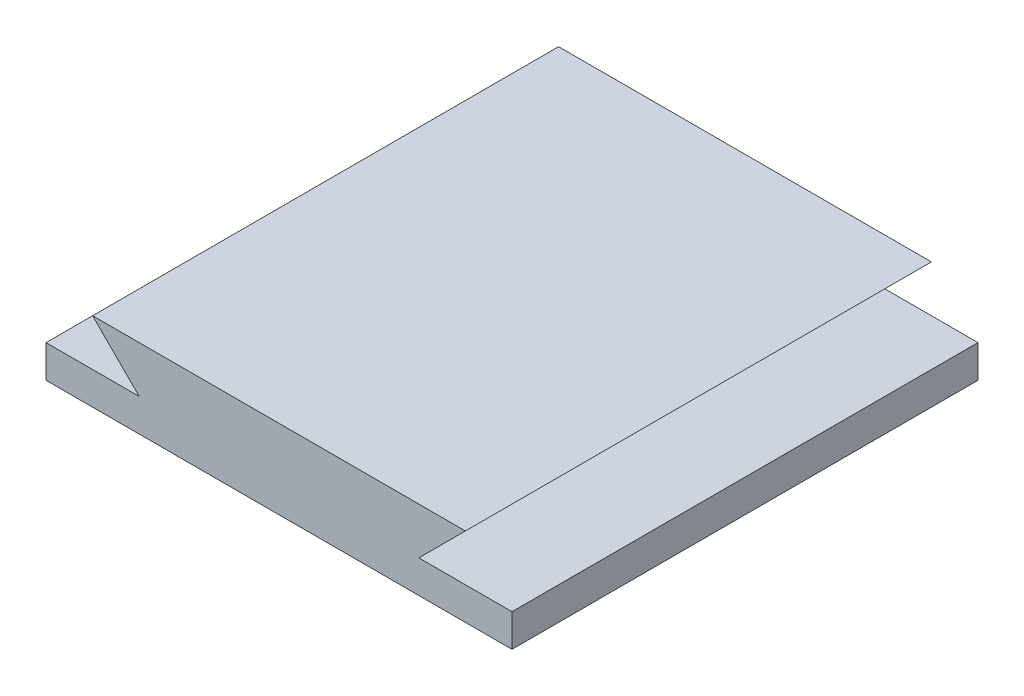
ISO-10303-21;
HEADER;
FILE_DESCRIPTION(('STEP AP214'),'2;1');
FILE_NAME('part.step','',(''),(''),'','','');
FILE_SCHEMA(('AUTOMOTIVE_DESIGN { 1 0 10303 214 1 1 1 1 }'));
ENDSEC;
DATA;
#1=APPLICATION_CONTEXT('core data for automotive mechanical design processes');
#2=APPLICATION_PROTOCOL_DEFINITION('international standard','automotive_design',2000,#1);
#3=PRODUCT_CONTEXT('',#1,'mechanical');
#4=PRODUCT('Part','Part','',(#3));
#5=PRODUCT_RELATED_PRODUCT_CATEGORY('part','',(#4));
#6=PRODUCT_DEFINITION_FORMATION('','',#4);
#7=PRODUCT_DEFINITION_CONTEXT('part definition',#1,'design');
#8=PRODUCT_DEFINITION('design','',#6,#7);
#9=PRODUCT_DEFINITION_SHAPE('','',#8);
#10=(LENGTH_UNIT() NAMED_UNIT(*) SI_UNIT(.MILLI.,.METRE.));
#11=(NAMED_UNIT(*) PLANE_ANGLE_UNIT() SI_UNIT($,.RADIAN.));
#12=(NAMED_UNIT(*) SI_UNIT($,.STERADIAN.) SOLID_ANGLE_UNIT());
#13=UNCERTAINTY_MEASURE_WITH_UNIT(LENGTH_MEASURE(1.E-05),#10,'distance_accuracy_value','');
#14=(GEOMETRIC_REPRESENTATION_CONTEXT(3) GLOBAL_UNCERTAINTY_ASSIGNED_CONTEXT((#13)) GLOBAL_UNIT_ASSIGNED_CONTEXT((#10,
#11,#12)) REPRESENTATION_CONTEXT('',''));
#15=CARTESIAN_POINT('',(0.,0.,0.));
#16=DIRECTION('',(0.,0.,1.));
#17=DIRECTION('',(1.,0.,0.));
#18=AXIS2_PLACEMENT_3D('',#15,#16,#17);
#19=CARTESIAN_POINT('',(13.2500000000002,-13.25,100.));
#20=DIRECTION('',(0.707106781186551,-0.707106781186544,0.));
#21=DIRECTION('',(0.707106781186544,0.707106781186551,0.));
#22=AXIS2_PLACEMENT_3D('',#19,#20,#21);
#23=PLANE('',#22);
#24=DIRECTION('',(-0.707106781186544,-0.707106781186551,0.));
#25=VECTOR('',#24,1.);
#26=CARTESIAN_POINT('',(13.2500000000002,-13.25,0.));
#27=LINE('',#26,#25);
#28=CARTESIAN_POINT('',(39.9999999999999,13.5,0.));
#29=VERTEX_POINT('',#28);
#30=CARTESIAN_POINT('',(30.,3.5,0.));
#31=VERTEX_POINT('',#30);
#32=EDGE_CURVE('E125',#29,#31,#27,.T.);
#33=ORIENTED_EDGE('',*,*,#32,.F.);
#34=DIRECTION('',(0.,0.,-1.));
#35=VECTOR('',#34,1.);
#36=CARTESIAN_POINT('',(39.9999999999999,13.5,100.));
#37=LINE('',#36,#35);
#38=CARTESIAN_POINT('',(39.9999999999999,13.5,100.));
#39=VERTEX_POINT('',#38);
#40=EDGE_CURVE('E11',#39,#29,#37,.T.);
#41=ORIENTED_EDGE('',*,*,#40,.F.);
#42=DIRECTION('',(-0.707106781186544,-0.707106781186551,0.));
#43=VECTOR('',#42,1.);
#44=CARTESIAN_POINT('',(13.2500000000002,-13.25,100.));
#45=LINE('',#44,#43);
#46=CARTESIAN_POINT('',(30.,3.5,100.));
#47=VERTEX_POINT('',#46);
#48=EDGE_CURVE('E170',#39,#47,#45,.T.);
#49=ORIENTED_EDGE('',*,*,#48,.T.);
#50=DIRECTION('',(0.,0.,-1.));
#51=VECTOR('',#50,1.);
#52=CARTESIAN_POINT('',(30.,3.5,100.));
#53=LINE('',#52,#51);
#54=EDGE_CURVE('E83',#47,#31,#53,.T.);
#55=ORIENTED_EDGE('',*,*,#54,.T.);
#56=EDGE_LOOP('',(#33,#41,#49,#55));
#57=FACE_BOUND('',#56,.T.);
#58=ADVANCED_FACE('F33',(#57),#23,.T.);
#59=CARTESIAN_POINT('',(0.,13.5,100.));
#60=DIRECTION('',(0.,1.,0.));
#61=DIRECTION('',(0.,0.,1.));
#62=AXIS2_PLACEMENT_3D('',#59,#60,#61);
#63=PLANE('',#62);
#64=DIRECTION('',(1.,0.,0.));
#65=VECTOR('',#64,1.);
#66=CARTESIAN_POINT('',(0.,13.5,0.));
#67=LINE('',#66,#65);
#68=CARTESIAN_POINT('',(-40.0000000000001,13.5,0.));
#69=VERTEX_POINT('',#68);
#70=EDGE_CURVE('E128',#69,#29,#67,.T.);
#71=ORIENTED_EDGE('',*,*,#70,.F.);
#72=DIRECTION('',(0.,0.,-1.));
#73=VECTOR('',#72,1.);
#74=CARTESIAN_POINT('',(-40.0000000000001,13.5,100.));
#75=LINE('',#74,#73);
#76=CARTESIAN_POINT('',(-40.0000000000001,13.5,100.));
#77=VERTEX_POINT('',#76);
#78=EDGE_CURVE('E41',#77,#69,#75,.T.);
#79=ORIENTED_EDGE('',*,*,#78,.F.);
#80=DIRECTION('',(1.,0.,0.));
#81=VECTOR('',#80,1.);
#82=CARTESIAN_POINT('',(0.,13.5,100.));
#83=LINE('',#82,#81);
#84=EDGE_CURVE('E168',#77,#39,#83,.T.);
#85=ORIENTED_EDGE('',*,*,#84,.T.);
#86=ORIENTED_EDGE('',*,*,#40,.T.);
#87=EDGE_LOOP('',(#71,#79,#85,#86));
#88=FACE_BOUND('',#87,.T.);
#89=ADVANCED_FACE('F159',(#88),#63,.T.);
#90=CARTESIAN_POINT('',(-13.2499999999998,-13.25,100.));
#91=DIRECTION('',(-0.707106781186544,-0.707106781186551,0.));
#92=DIRECTION('',(0.707106781186551,-0.707106781186544,0.));
#93=AXIS2_PLACEMENT_3D('',#90,#91,#92);
#94=PLANE('',#93);
#95=DIRECTION('',(-0.707106781186551,0.707106781186544,0.));
#96=VECTOR('',#95,1.);
#97=CARTESIAN_POINT('',(-13.2499999999998,-13.25,0.));
#98=LINE('',#97,#96);
#99=CARTESIAN_POINT('',(-30.,3.49999999999999,0.));
#100=VERTEX_POINT('',#99);
#101=EDGE_CURVE('E131',#100,#69,#98,.T.);
#102=ORIENTED_EDGE('',*,*,#101,.F.);
#103=DIRECTION('',(0.,0.,-1.));
#104=VECTOR('',#103,1.);
#105=CARTESIAN_POINT('',(-30.,3.49999999999999,100.));
#106=LINE('',#105,#104);
#107=CARTESIAN_POINT('',(-30.,3.49999999999999,100.));
#108=VERTEX_POINT('',#107);
#109=EDGE_CURVE('E148',#108,#100,#106,.T.);
#110=ORIENTED_EDGE('',*,*,#109,.F.);
#111=DIRECTION('',(-0.707106781186551,0.707106781186544,0.));
#112=VECTOR('',#111,1.);
#113=CARTESIAN_POINT('',(-13.2499999999998,-13.25,100.));
#114=LINE('',#113,#112);
#115=EDGE_CURVE('E155',#108,#77,#114,.T.);
#116=ORIENTED_EDGE('',*,*,#115,.T.);
#117=ORIENTED_EDGE('',*,*,#78,.T.);
#118=EDGE_LOOP('',(#102,#110,#116,#117));
#119=FACE_BOUND('',#118,.T.);
#120=ADVANCED_FACE('F153',(#119),#94,.T.);
#121=CARTESIAN_POINT('',(0.,3.5,100.));
#122=DIRECTION('',(0.,-1.,0.));
#123=DIRECTION('',(1.,0.,0.));
#124=AXIS2_PLACEMENT_3D('',#121,#122,#123);
#125=PLANE('',#124);
#126=DIRECTION('',(-1.,0.,0.));
#127=VECTOR('',#126,1.);
#128=CARTESIAN_POINT('',(0.,3.5,0.));
#129=LINE('',#128,#127);
#130=CARTESIAN_POINT('',(-50.,3.49999999999999,0.));
#131=VERTEX_POINT('',#130);
#132=EDGE_CURVE('E134',#100,#131,#129,.T.);
#133=ORIENTED_EDGE('',*,*,#132,.T.);
#134=DIRECTION('',(0.,0.,-1.));
#135=VECTOR('',#134,1.);
#136=CARTESIAN_POINT('',(-50.,3.49999999999999,100.));
#137=LINE('',#136,#135);
#138=CARTESIAN_POINT('',(-50.,3.49999999999999,100.));
#139=VERTEX_POINT('',#138);
#140=EDGE_CURVE('E146',#139,#131,#137,.T.);
#141=ORIENTED_EDGE('',*,*,#140,.F.);
#142=DIRECTION('',(-1.,0.,0.));
#143=VECTOR('',#142,1.);
#144=CARTESIAN_POINT('',(0.,3.5,100.));
#145=LINE('',#144,#143);
#146=EDGE_CURVE('E121',#108,#139,#145,.T.);
#147=ORIENTED_EDGE('',*,*,#146,.F.);
#148=ORIENTED_EDGE('',*,*,#109,.T.);
#149=EDGE_LOOP('',(#133,#141,#147,#148));
#150=FACE_BOUND('',#149,.T.);
#151=ADVANCED_FACE('F166',(#150),#125,.F.);
#152=CARTESIAN_POINT('',(-50.,0.,100.));
#153=DIRECTION('',(-1.,0.,0.));
#154=DIRECTION('',(0.,0.,1.));
#155=AXIS2_PLACEMENT_3D('',#152,#153,#154);
#156=PLANE('',#155);
#157=DIRECTION('',(0.,1.,0.));
#158=VECTOR('',#157,1.);
#159=CARTESIAN_POINT('',(-50.,0.,0.));
#160=LINE('',#159,#158);
#161=CARTESIAN_POINT('',(-50.,-3.50000000000001,0.));
#162=VERTEX_POINT('',#161);
#163=EDGE_CURVE('E137',#162,#131,#160,.T.);
#164=ORIENTED_EDGE('',*,*,#163,.F.);
#165=DIRECTION('',(0.,0.,-1.));
#166=VECTOR('',#165,1.);
#167=CARTESIAN_POINT('',(-50.,-3.50000000000001,100.));
#168=LINE('',#167,#166);
#169=CARTESIAN_POINT('',(-50.,-3.50000000000001,100.));
#170=VERTEX_POINT('',#169);
#171=EDGE_CURVE('E110',#170,#162,#168,.T.);
#172=ORIENTED_EDGE('',*,*,#171,.F.);
#173=DIRECTION('',(0.,1.,0.));
#174=VECTOR('',#173,1.);
#175=CARTESIAN_POINT('',(-50.,0.,100.));
#176=LINE('',#175,#174);
#177=EDGE_CURVE('E119',#170,#139,#176,.T.);
#178=ORIENTED_EDGE('',*,*,#177,.T.);
#179=ORIENTED_EDGE('',*,*,#140,.T.);
#180=EDGE_LOOP('',(#164,#172,#178,#179));
#181=FACE_BOUND('',#180,.T.);
#182=ADVANCED_FACE('F185',(#181),#156,.T.);
#183=CARTESIAN_POINT('',(0.,-3.5,100.));
#184=DIRECTION('',(0.,-1.,0.));
#185=DIRECTION('',(1.,0.,0.));
#186=AXIS2_PLACEMENT_3D('',#183,#184,#185);
#187=PLANE('',#186);
#188=DIRECTION('',(-1.,0.,0.));
#189=VECTOR('',#188,1.);
#190=CARTESIAN_POINT('',(0.,-3.5,0.));
#191=LINE('',#190,#189);
#192=CARTESIAN_POINT('',(50.,-3.5,0.));
#193=VERTEX_POINT('',#192);
#194=EDGE_CURVE('E109',#193,#162,#191,.T.);
#195=ORIENTED_EDGE('',*,*,#194,.F.);
#196=DIRECTION('',(0.,0.,-1.));
#197=VECTOR('',#196,1.);
#198=CARTESIAN_POINT('',(50.,-3.5,100.));
#199=LINE('',#198,#197);
#200=CARTESIAN_POINT('',(50.,-3.5,100.));
#201=VERTEX_POINT('',#200);
#202=EDGE_CURVE('E103',#201,#193,#199,.T.);
#203=ORIENTED_EDGE('',*,*,#202,.F.);
#204=DIRECTION('',(-1.,0.,0.));
#205=VECTOR('',#204,1.);
#206=CARTESIAN_POINT('',(0.,-3.5,100.));
#207=LINE('',#206,#205);
#208=EDGE_CURVE('E107',#201,#170,#207,.T.);
#209=ORIENTED_EDGE('',*,*,#208,.T.);
#210=ORIENTED_EDGE('',*,*,#171,.T.);
#211=EDGE_LOOP('',(#195,#203,#209,#210));
#212=FACE_BOUND('',#211,.T.);
#213=ADVANCED_FACE('F105',(#212),#187,.T.);
#214=CARTESIAN_POINT('',(50.,0.,100.));
#215=DIRECTION('',(-1.,0.,0.));
#216=DIRECTION('',(0.,0.,1.));
#217=AXIS2_PLACEMENT_3D('',#214,#215,#216);
#218=PLANE('',#217);
#219=DIRECTION('',(0.,1.,0.));
#220=VECTOR('',#219,1.);
#221=CARTESIAN_POINT('',(50.,0.,0.));
#222=LINE('',#221,#220);
#223=CARTESIAN_POINT('',(50.,3.5,0.));
#224=VERTEX_POINT('',#223);
#225=EDGE_CURVE('E76',#193,#224,#222,.T.);
#226=ORIENTED_EDGE('',*,*,#225,.T.);
#227=DIRECTION('',(0.,0.,-1.));
#228=VECTOR('',#227,1.);
#229=CARTESIAN_POINT('',(50.,3.5,100.));
#230=LINE('',#229,#228);
#231=CARTESIAN_POINT('',(50.,3.5,100.));
#232=VERTEX_POINT('',#231);
#233=EDGE_CURVE('E111',#232,#224,#230,.T.);
#234=ORIENTED_EDGE('',*,*,#233,.F.);
#235=DIRECTION('',(0.,1.,0.));
#236=VECTOR('',#235,1.);
#237=CARTESIAN_POINT('',(50.,0.,100.));
#238=LINE('',#237,#236);
#239=EDGE_CURVE('E113',#201,#232,#238,.T.);
#240=ORIENTED_EDGE('',*,*,#239,.F.);
#241=ORIENTED_EDGE('',*,*,#202,.T.);
#242=EDGE_LOOP('',(#226,#234,#240,#241));
#243=FACE_BOUND('',#242,.T.);
#244=ADVANCED_FACE('F114',(#243),#218,.F.);
#245=EDGE_CURVE('E138',#224,#31,#129,.T.);
#246=ORIENTED_EDGE('',*,*,#245,.T.);
#247=ORIENTED_EDGE('',*,*,#54,.F.);
#248=EDGE_CURVE('E49',#232,#47,#145,.T.);
#249=ORIENTED_EDGE('',*,*,#248,.F.);
#250=ORIENTED_EDGE('',*,*,#233,.T.);
#251=EDGE_LOOP('',(#246,#247,#249,#250));
#252=FACE_BOUND('',#251,.T.);
#253=ADVANCED_FACE('F175',(#252),#125,.F.);
#254=CARTESIAN_POINT('',(0.,0.,100.));
#255=DIRECTION('',(0.,0.,1.));
#256=DIRECTION('',(1.,0.,0.));
#257=AXIS2_PLACEMENT_3D('',#254,#255,#256);
#258=PLANE('',#257);
#259=ORIENTED_EDGE('',*,*,#48,.F.);
#260=ORIENTED_EDGE('',*,*,#84,.F.);
#261=ORIENTED_EDGE('',*,*,#115,.F.);
#262=ORIENTED_EDGE('',*,*,#146,.T.);
#263=ORIENTED_EDGE('',*,*,#177,.F.);
#264=ORIENTED_EDGE('',*,*,#208,.F.);
#265=ORIENTED_EDGE('',*,*,#239,.T.);
#266=ORIENTED_EDGE('',*,*,#248,.T.);
#267=EDGE_LOOP('',(#259,#260,#261,#262,#263,#264,#265,#266));
#268=FACE_BOUND('',#267,.T.);
#269=ADVANCED_FACE('F117',(#268),#258,.T.);
#270=CARTESIAN_POINT('',(0.,0.,0.));
#271=DIRECTION('',(0.,0.,1.));
#272=DIRECTION('',(1.,0.,0.));
#273=AXIS2_PLACEMENT_3D('',#270,#271,#272);
#274=PLANE('',#273);
#275=ORIENTED_EDGE('',*,*,#32,.T.);
#276=ORIENTED_EDGE('',*,*,#245,.F.);
#277=ORIENTED_EDGE('',*,*,#225,.F.);
#278=ORIENTED_EDGE('',*,*,#194,.T.);
#279=ORIENTED_EDGE('',*,*,#163,.T.);
#280=ORIENTED_EDGE('',*,*,#132,.F.);
#281=ORIENTED_EDGE('',*,*,#101,.T.);
#282=ORIENTED_EDGE('',*,*,#70,.T.);
#283=EDGE_LOOP('',(#275,#276,#277,#278,#279,#280,#281,#282));
#284=FACE_BOUND('',#283,.T.);
#285=ADVANCED_FACE('F162',(#284),#274,.F.);
#286=CLOSED_SHELL('',(#58,#89,#120,#151,#182,#213,#244,#253,#269,#285));
#287=MANIFOLD_SOLID_BREP('B2',#286);
#288=ADVANCED_BREP_SHAPE_REPRESENTATION('',(#18,#287),#14);
#289=SHAPE_DEFINITION_REPRESENTATION(#9,#288);
ENDSEC;
END-ISO-10303-21;
